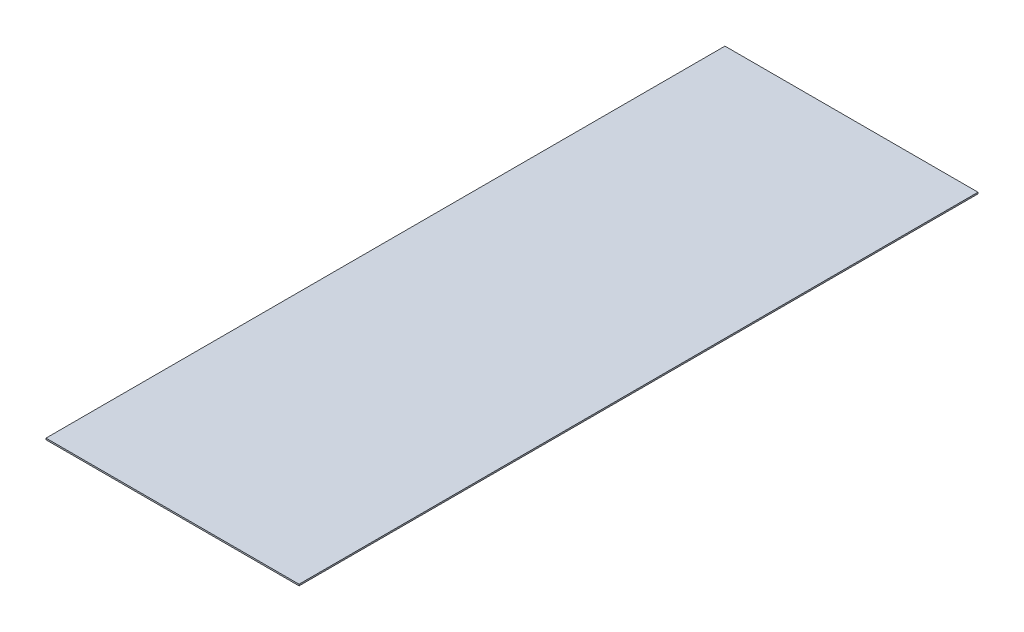
ISO-10303-21;
HEADER;
FILE_DESCRIPTION(('STEP AP214'),'2;1');
FILE_NAME('part.step','',(''),(''),'','','');
FILE_SCHEMA(('AUTOMOTIVE_DESIGN { 1 0 10303 214 1 1 1 1 }'));
ENDSEC;
DATA;
#1=APPLICATION_CONTEXT('core data for automotive mechanical design processes');
#2=APPLICATION_PROTOCOL_DEFINITION('international standard','automotive_design',2000,#1);
#3=PRODUCT_CONTEXT('',#1,'mechanical');
#4=PRODUCT('Part','Part','',(#3));
#5=PRODUCT_RELATED_PRODUCT_CATEGORY('part','',(#4));
#6=PRODUCT_DEFINITION_FORMATION('','',#4);
#7=PRODUCT_DEFINITION_CONTEXT('part definition',#1,'design');
#8=PRODUCT_DEFINITION('design','',#6,#7);
#9=PRODUCT_DEFINITION_SHAPE('','',#8);
#10=(LENGTH_UNIT() NAMED_UNIT(*) SI_UNIT(.MILLI.,.METRE.));
#11=(NAMED_UNIT(*) PLANE_ANGLE_UNIT() SI_UNIT($,.RADIAN.));
#12=(NAMED_UNIT(*) SI_UNIT($,.STERADIAN.) SOLID_ANGLE_UNIT());
#13=UNCERTAINTY_MEASURE_WITH_UNIT(LENGTH_MEASURE(1.E-05),#10,'distance_accuracy_value','');
#14=(GEOMETRIC_REPRESENTATION_CONTEXT(3) GLOBAL_UNCERTAINTY_ASSIGNED_CONTEXT((#13)) GLOBAL_UNIT_ASSIGNED_CONTEXT((#10,
#11,#12)) REPRESENTATION_CONTEXT('',''));
#15=CARTESIAN_POINT('',(0.,0.,0.));
#16=DIRECTION('',(0.,0.,1.));
#17=DIRECTION('',(1.,0.,0.));
#18=AXIS2_PLACEMENT_3D('',#15,#16,#17);
#19=CARTESIAN_POINT('',(0.,12.7,0.));
#20=DIRECTION('',(1.,0.,0.));
#21=DIRECTION('',(0.,0.,-1.));
#22=AXIS2_PLACEMENT_3D('',#19,#20,#21);
#23=PLANE('',#22);
#24=DIRECTION('',(0.,0.,1.));
#25=VECTOR('',#24,1.);
#26=CARTESIAN_POINT('',(0.,0.,0.));
#27=LINE('',#26,#25);
#28=CARTESIAN_POINT('',(0.,0.,-5826.76));
#29=VERTEX_POINT('',#28);
#30=CARTESIAN_POINT('',(0.,0.,0.));
#31=VERTEX_POINT('',#30);
#32=EDGE_CURVE('E97',#29,#31,#27,.T.);
#33=ORIENTED_EDGE('',*,*,#32,.T.);
#34=DIRECTION('',(0.,-1.,0.));
#35=VECTOR('',#34,1.);
#36=CARTESIAN_POINT('',(0.,12.7,0.));
#37=LINE('',#36,#35);
#38=CARTESIAN_POINT('',(0.,12.7,0.));
#39=VERTEX_POINT('',#38);
#40=EDGE_CURVE('E11',#39,#31,#37,.T.);
#41=ORIENTED_EDGE('',*,*,#40,.F.);
#42=DIRECTION('',(0.,0.,1.));
#43=VECTOR('',#42,1.);
#44=CARTESIAN_POINT('',(0.,12.7,0.));
#45=LINE('',#44,#43);
#46=CARTESIAN_POINT('',(0.,12.7,-5826.76));
#47=VERTEX_POINT('',#46);
#48=EDGE_CURVE('E85',#47,#39,#45,.T.);
#49=ORIENTED_EDGE('',*,*,#48,.F.);
#50=DIRECTION('',(0.,-1.,0.));
#51=VECTOR('',#50,1.);
#52=CARTESIAN_POINT('',(0.,12.7,-5826.76));
#53=LINE('',#52,#51);
#54=EDGE_CURVE('E93',#47,#29,#53,.T.);
#55=ORIENTED_EDGE('',*,*,#54,.T.);
#56=EDGE_LOOP('',(#33,#41,#49,#55));
#57=FACE_BOUND('',#56,.T.);
#58=ADVANCED_FACE('F34',(#57),#23,.F.);
#59=CARTESIAN_POINT('',(0.,12.7,0.));
#60=DIRECTION('',(0.,0.,-1.));
#61=DIRECTION('',(-1.,0.,0.));
#62=AXIS2_PLACEMENT_3D('',#59,#60,#61);
#63=PLANE('',#62);
#64=DIRECTION('',(1.,0.,0.));
#65=VECTOR('',#64,1.);
#66=CARTESIAN_POINT('',(0.,0.,0.));
#67=LINE('',#66,#65);
#68=CARTESIAN_POINT('',(2171.7,0.,0.));
#69=VERTEX_POINT('',#68);
#70=EDGE_CURVE('E89',#31,#69,#67,.T.);
#71=ORIENTED_EDGE('',*,*,#70,.T.);
#72=DIRECTION('',(0.,-1.,0.));
#73=VECTOR('',#72,1.);
#74=CARTESIAN_POINT('',(2171.7,12.7,0.));
#75=LINE('',#74,#73);
#76=CARTESIAN_POINT('',(2171.7,12.7,0.));
#77=VERTEX_POINT('',#76);
#78=EDGE_CURVE('E42',#77,#69,#75,.T.);
#79=ORIENTED_EDGE('',*,*,#78,.F.);
#80=DIRECTION('',(1.,0.,0.));
#81=VECTOR('',#80,1.);
#82=CARTESIAN_POINT('',(0.,12.7,0.));
#83=LINE('',#82,#81);
#84=EDGE_CURVE('E80',#39,#77,#83,.T.);
#85=ORIENTED_EDGE('',*,*,#84,.F.);
#86=ORIENTED_EDGE('',*,*,#40,.T.);
#87=EDGE_LOOP('',(#71,#79,#85,#86));
#88=FACE_BOUND('',#87,.T.);
#89=ADVANCED_FACE('F88',(#88),#63,.F.);
#90=CARTESIAN_POINT('',(2171.7,12.7,0.));
#91=DIRECTION('',(-1.,0.,0.));
#92=DIRECTION('',(0.,0.,1.));
#93=AXIS2_PLACEMENT_3D('',#90,#91,#92);
#94=PLANE('',#93);
#95=DIRECTION('',(0.,0.,-1.));
#96=VECTOR('',#95,1.);
#97=CARTESIAN_POINT('',(2171.7,0.,0.));
#98=LINE('',#97,#96);
#99=CARTESIAN_POINT('',(2171.7,0.,-5826.76));
#100=VERTEX_POINT('',#99);
#101=EDGE_CURVE('E67',#69,#100,#98,.T.);
#102=ORIENTED_EDGE('',*,*,#101,.T.);
#103=DIRECTION('',(0.,-1.,0.));
#104=VECTOR('',#103,1.);
#105=CARTESIAN_POINT('',(2171.7,12.7,-5826.76));
#106=LINE('',#105,#104);
#107=CARTESIAN_POINT('',(2171.7,12.7,-5826.76));
#108=VERTEX_POINT('',#107);
#109=EDGE_CURVE('E90',#108,#100,#106,.T.);
#110=ORIENTED_EDGE('',*,*,#109,.F.);
#111=DIRECTION('',(0.,0.,-1.));
#112=VECTOR('',#111,1.);
#113=CARTESIAN_POINT('',(2171.7,12.7,0.));
#114=LINE('',#113,#112);
#115=EDGE_CURVE('E83',#77,#108,#114,.T.);
#116=ORIENTED_EDGE('',*,*,#115,.F.);
#117=ORIENTED_EDGE('',*,*,#78,.T.);
#118=EDGE_LOOP('',(#102,#110,#116,#117));
#119=FACE_BOUND('',#118,.T.);
#120=ADVANCED_FACE('F91',(#119),#94,.F.);
#121=CARTESIAN_POINT('',(0.,12.7,-5826.76));
#122=DIRECTION('',(0.,0.,1.));
#123=DIRECTION('',(1.,0.,0.));
#124=AXIS2_PLACEMENT_3D('',#121,#122,#123);
#125=PLANE('',#124);
#126=DIRECTION('',(-1.,0.,0.));
#127=VECTOR('',#126,1.);
#128=CARTESIAN_POINT('',(0.,0.,-5826.76));
#129=LINE('',#128,#127);
#130=EDGE_CURVE('E73',#100,#29,#129,.T.);
#131=ORIENTED_EDGE('',*,*,#130,.T.);
#132=ORIENTED_EDGE('',*,*,#54,.F.);
#133=DIRECTION('',(-1.,0.,0.));
#134=VECTOR('',#133,1.);
#135=CARTESIAN_POINT('',(0.,12.7,-5826.76));
#136=LINE('',#135,#134);
#137=EDGE_CURVE('E50',#108,#47,#136,.T.);
#138=ORIENTED_EDGE('',*,*,#137,.F.);
#139=ORIENTED_EDGE('',*,*,#109,.T.);
#140=EDGE_LOOP('',(#131,#132,#138,#139));
#141=FACE_BOUND('',#140,.T.);
#142=ADVANCED_FACE('F104',(#141),#125,.F.);
#143=CARTESIAN_POINT('',(0.,12.7,0.));
#144=DIRECTION('',(0.,-1.,0.));
#145=DIRECTION('',(0.,0.,-1.));
#146=AXIS2_PLACEMENT_3D('',#143,#144,#145);
#147=PLANE('',#146);
#148=ORIENTED_EDGE('',*,*,#48,.T.);
#149=ORIENTED_EDGE('',*,*,#84,.T.);
#150=ORIENTED_EDGE('',*,*,#115,.T.);
#151=ORIENTED_EDGE('',*,*,#137,.T.);
#152=EDGE_LOOP('',(#148,#149,#150,#151));
#153=FACE_BOUND('',#152,.T.);
#154=ADVANCED_FACE('F81',(#153),#147,.F.);
#155=CARTESIAN_POINT('',(0.,0.,0.));
#156=DIRECTION('',(0.,-1.,0.));
#157=DIRECTION('',(0.,0.,-1.));
#158=AXIS2_PLACEMENT_3D('',#155,#156,#157);
#159=PLANE('',#158);
#160=ORIENTED_EDGE('',*,*,#32,.F.);
#161=ORIENTED_EDGE('',*,*,#130,.F.);
#162=ORIENTED_EDGE('',*,*,#101,.F.);
#163=ORIENTED_EDGE('',*,*,#70,.F.);
#164=EDGE_LOOP('',(#160,#161,#162,#163));
#165=FACE_BOUND('',#164,.T.);
#166=ADVANCED_FACE('F107',(#165),#159,.T.);
#167=CLOSED_SHELL('',(#58,#89,#120,#142,#154,#166));
#168=MANIFOLD_SOLID_BREP('B2',#167);
#169=ADVANCED_BREP_SHAPE_REPRESENTATION('',(#18,#168),#14);
#170=SHAPE_DEFINITION_REPRESENTATION(#9,#169);
ENDSEC;
END-ISO-10303-21;
